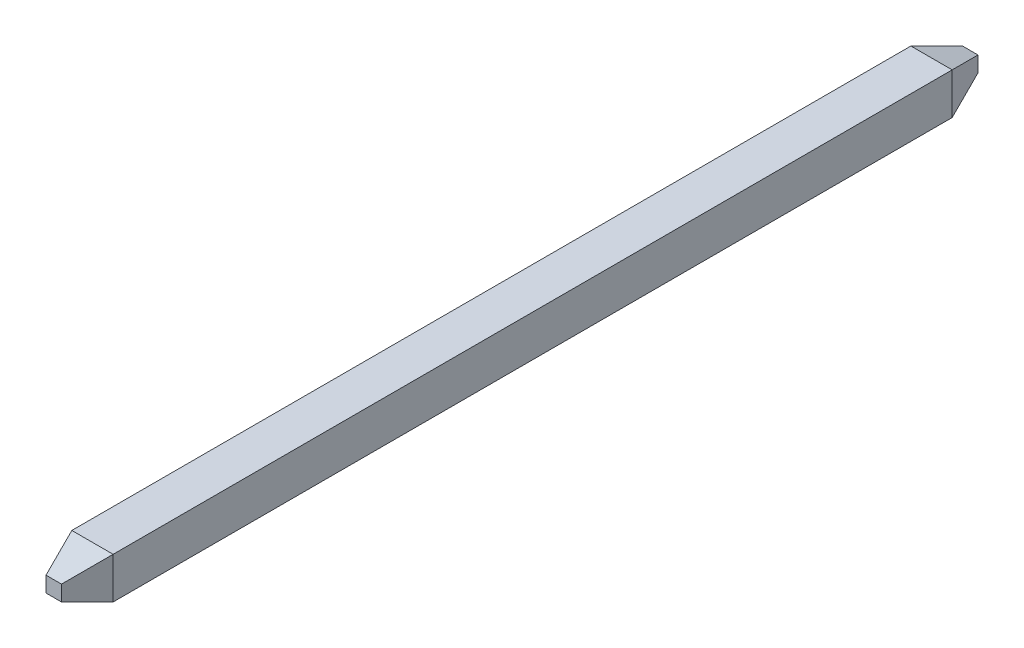
ISO-10303-21;
HEADER;
FILE_DESCRIPTION(('STEP AP214'),'2;1');
FILE_NAME('part.step','',(''),(''),'','','');
FILE_SCHEMA(('AUTOMOTIVE_DESIGN { 1 0 10303 214 1 1 1 1 }'));
ENDSEC;
DATA;
#1=APPLICATION_CONTEXT('core data for automotive mechanical design processes');
#2=APPLICATION_PROTOCOL_DEFINITION('international standard','automotive_design',2000,#1);
#3=PRODUCT_CONTEXT('',#1,'mechanical');
#4=PRODUCT('Part','Part','',(#3));
#5=PRODUCT_RELATED_PRODUCT_CATEGORY('part','',(#4));
#6=PRODUCT_DEFINITION_FORMATION('','',#4);
#7=PRODUCT_DEFINITION_CONTEXT('part definition',#1,'design');
#8=PRODUCT_DEFINITION('design','',#6,#7);
#9=PRODUCT_DEFINITION_SHAPE('','',#8);
#10=(LENGTH_UNIT() NAMED_UNIT(*) SI_UNIT(.MILLI.,.METRE.));
#11=(NAMED_UNIT(*) PLANE_ANGLE_UNIT() SI_UNIT($,.RADIAN.));
#12=(NAMED_UNIT(*) SI_UNIT($,.STERADIAN.) SOLID_ANGLE_UNIT());
#13=UNCERTAINTY_MEASURE_WITH_UNIT(LENGTH_MEASURE(1.E-05),#10,'distance_accuracy_value','');
#14=(GEOMETRIC_REPRESENTATION_CONTEXT(3) GLOBAL_UNCERTAINTY_ASSIGNED_CONTEXT((#13)) GLOBAL_UNIT_ASSIGNED_CONTEXT((#10,
#11,#12)) REPRESENTATION_CONTEXT('',''));
#15=CARTESIAN_POINT('',(0.,0.,0.));
#16=DIRECTION('',(0.,0.,1.));
#17=DIRECTION('',(1.,0.,0.));
#18=AXIS2_PLACEMENT_3D('',#15,#16,#17);
#19=CARTESIAN_POINT('',(0.32,0.,0.));
#20=DIRECTION('',(1.,0.,0.));
#21=DIRECTION('',(0.,1.,0.));
#22=AXIS2_PLACEMENT_3D('',#19,#20,#21);
#23=PLANE('',#22);
#24=DIRECTION('',(0.,0.,-1.));
#25=VECTOR('',#24,1.);
#26=CARTESIAN_POINT('',(0.32,-0.32,7.1));
#27=LINE('',#26,#25);
#28=CARTESIAN_POINT('',(0.32,-0.32,6.5));
#29=VERTEX_POINT('',#28);
#30=CARTESIAN_POINT('',(0.32,-0.32,-6.5));
#31=VERTEX_POINT('',#30);
#32=EDGE_CURVE('E115',#29,#31,#27,.T.);
#33=ORIENTED_EDGE('',*,*,#32,.T.);
#34=DIRECTION('',(0.,1.,0.));
#35=VECTOR('',#34,1.);
#36=CARTESIAN_POINT('',(0.32,0.32,-6.5));
#37=LINE('',#36,#35);
#38=CARTESIAN_POINT('',(0.32,0.32,-6.5));
#39=VERTEX_POINT('',#38);
#40=EDGE_CURVE('E85',#31,#39,#37,.T.);
#41=ORIENTED_EDGE('',*,*,#40,.T.);
#42=DIRECTION('',(0.,0.,1.));
#43=VECTOR('',#42,1.);
#44=CARTESIAN_POINT('',(0.32,0.32,-7.1));
#45=LINE('',#44,#43);
#46=CARTESIAN_POINT('',(0.32,0.32,6.5));
#47=VERTEX_POINT('',#46);
#48=EDGE_CURVE('E113',#39,#47,#45,.T.);
#49=ORIENTED_EDGE('',*,*,#48,.T.);
#50=DIRECTION('',(0.,-1.,0.));
#51=VECTOR('',#50,1.);
#52=CARTESIAN_POINT('',(0.32,-0.32,6.5));
#53=LINE('',#52,#51);
#54=EDGE_CURVE('E11',#47,#29,#53,.T.);
#55=ORIENTED_EDGE('',*,*,#54,.T.);
#56=EDGE_LOOP('',(#33,#41,#49,#55));
#57=FACE_BOUND('',#56,.T.);
#58=ADVANCED_FACE('F17',(#57),#23,.T.);
#59=CARTESIAN_POINT('',(-0.32,0.,0.));
#60=DIRECTION('',(1.,0.,0.));
#61=DIRECTION('',(0.,1.,0.));
#62=AXIS2_PLACEMENT_3D('',#59,#60,#61);
#63=PLANE('',#62);
#64=DIRECTION('',(0.,0.,1.));
#65=VECTOR('',#64,1.);
#66=CARTESIAN_POINT('',(-0.32,0.32,-7.1));
#67=LINE('',#66,#65);
#68=CARTESIAN_POINT('',(-0.32,0.32,-6.5));
#69=VERTEX_POINT('',#68);
#70=CARTESIAN_POINT('',(-0.32,0.32,6.5));
#71=VERTEX_POINT('',#70);
#72=EDGE_CURVE('E140',#69,#71,#67,.T.);
#73=ORIENTED_EDGE('',*,*,#72,.F.);
#74=DIRECTION('',(0.,-1.,0.));
#75=VECTOR('',#74,1.);
#76=CARTESIAN_POINT('',(-0.32,0.,-6.5));
#77=LINE('',#76,#75);
#78=CARTESIAN_POINT('',(-0.32,-0.32,-6.5));
#79=VERTEX_POINT('',#78);
#80=EDGE_CURVE('E97',#69,#79,#77,.T.);
#81=ORIENTED_EDGE('',*,*,#80,.T.);
#82=DIRECTION('',(0.,0.,-1.));
#83=VECTOR('',#82,1.);
#84=CARTESIAN_POINT('',(-0.32,-0.32,7.1));
#85=LINE('',#84,#83);
#86=CARTESIAN_POINT('',(-0.32,-0.32,6.5));
#87=VERTEX_POINT('',#86);
#88=EDGE_CURVE('E160',#87,#79,#85,.T.);
#89=ORIENTED_EDGE('',*,*,#88,.F.);
#90=DIRECTION('',(0.,1.,0.));
#91=VECTOR('',#90,1.);
#92=CARTESIAN_POINT('',(-0.32,0.,6.5));
#93=LINE('',#92,#91);
#94=EDGE_CURVE('E166',#87,#71,#93,.T.);
#95=ORIENTED_EDGE('',*,*,#94,.T.);
#96=EDGE_LOOP('',(#73,#81,#89,#95));
#97=FACE_BOUND('',#96,.T.);
#98=ADVANCED_FACE('F250',(#97),#63,.F.);
#99=CARTESIAN_POINT('',(0.32,-0.32,6.5));
#100=DIRECTION('',(0.,0.948683298050514,-0.316227766016838));
#101=DIRECTION('',(-1.,0.,0.));
#102=AXIS2_PLACEMENT_3D('',#99,#100,#101);
#103=PLANE('',#102);
#104=DIRECTION('',(0.301511344578037,0.301511344578037,0.904534033733109));
#105=VECTOR('',#104,1.);
#106=CARTESIAN_POINT('',(-0.08,-0.08,7.22));
#107=LINE('',#106,#105);
#108=CARTESIAN_POINT('',(-0.12,-0.12,7.1));
#109=VERTEX_POINT('',#108);
#110=EDGE_CURVE('E42',#87,#109,#107,.T.);
#111=ORIENTED_EDGE('',*,*,#110,.F.);
#112=DIRECTION('',(-1.,0.,0.));
#113=VECTOR('',#112,1.);
#114=CARTESIAN_POINT('',(0.32,-0.32,6.5));
#115=LINE('',#114,#113);
#116=EDGE_CURVE('E178',#29,#87,#115,.T.);
#117=ORIENTED_EDGE('',*,*,#116,.F.);
#118=DIRECTION('',(0.301511344578037,-0.301511344578037,-0.904534033733109));
#119=VECTOR('',#118,1.);
#120=CARTESIAN_POINT('',(0.32,-0.32,6.5));
#121=LINE('',#120,#119);
#122=CARTESIAN_POINT('',(0.12,-0.12,7.1));
#123=VERTEX_POINT('',#122);
#124=EDGE_CURVE('E28',#123,#29,#121,.T.);
#125=ORIENTED_EDGE('',*,*,#124,.F.);
#126=DIRECTION('',(1.,0.,0.));
#127=VECTOR('',#126,1.);
#128=CARTESIAN_POINT('',(0.32,-0.12,7.1));
#129=LINE('',#128,#127);
#130=EDGE_CURVE('E131',#109,#123,#129,.T.);
#131=ORIENTED_EDGE('',*,*,#130,.F.);
#132=EDGE_LOOP('',(#111,#117,#125,#131));
#133=FACE_BOUND('',#132,.T.);
#134=ADVANCED_FACE('F245',(#133),#103,.F.);
#135=CARTESIAN_POINT('',(0.32,0.,6.5));
#136=DIRECTION('',(0.948683298050514,0.,0.316227766016838));
#137=DIRECTION('',(0.,-1.,0.));
#138=AXIS2_PLACEMENT_3D('',#135,#136,#137);
#139=PLANE('',#138);
#140=ORIENTED_EDGE('',*,*,#124,.T.);
#141=ORIENTED_EDGE('',*,*,#54,.F.);
#142=DIRECTION('',(0.301511344578037,0.301511344578037,-0.904534033733109));
#143=VECTOR('',#142,1.);
#144=CARTESIAN_POINT('',(0.290909090909,0.290909090909,6.587272727273));
#145=LINE('',#144,#143);
#146=CARTESIAN_POINT('',(0.12,0.12,7.1));
#147=VERTEX_POINT('',#146);
#148=EDGE_CURVE('E118',#147,#47,#145,.T.);
#149=ORIENTED_EDGE('',*,*,#148,.F.);
#150=DIRECTION('',(0.,1.,0.));
#151=VECTOR('',#150,1.);
#152=CARTESIAN_POINT('',(0.12,0.32,7.1));
#153=LINE('',#152,#151);
#154=EDGE_CURVE('E173',#123,#147,#153,.T.);
#155=ORIENTED_EDGE('',*,*,#154,.F.);
#156=EDGE_LOOP('',(#140,#141,#149,#155));
#157=FACE_BOUND('',#156,.T.);
#158=ADVANCED_FACE('F19',(#157),#139,.T.);
#159=CARTESIAN_POINT('',(-0.12,0.32,7.1));
#160=DIRECTION('',(0.948683298050514,0.,-0.316227766016838));
#161=DIRECTION('',(0.,-1.,0.));
#162=AXIS2_PLACEMENT_3D('',#159,#160,#161);
#163=PLANE('',#162);
#164=ORIENTED_EDGE('',*,*,#110,.T.);
#165=DIRECTION('',(0.,-1.,0.));
#166=VECTOR('',#165,1.);
#167=CARTESIAN_POINT('',(-0.12,0.32,7.1));
#168=LINE('',#167,#166);
#169=CARTESIAN_POINT('',(-0.12,0.12,7.1));
#170=VERTEX_POINT('',#169);
#171=EDGE_CURVE('E341',#170,#109,#168,.T.);
#172=ORIENTED_EDGE('',*,*,#171,.F.);
#173=DIRECTION('',(-0.301511344578037,0.301511344578037,-0.904534033733109));
#174=VECTOR('',#173,1.);
#175=CARTESIAN_POINT('',(-0.138181818182,0.138181818182,7.045454545455));
#176=LINE('',#175,#174);
#177=EDGE_CURVE('E157',#170,#71,#176,.T.);
#178=ORIENTED_EDGE('',*,*,#177,.T.);
#179=ORIENTED_EDGE('',*,*,#94,.F.);
#180=EDGE_LOOP('',(#164,#172,#178,#179));
#181=FACE_BOUND('',#180,.T.);
#182=ADVANCED_FACE('F230',(#181),#163,.F.);
#183=CARTESIAN_POINT('',(0.32,0.12,7.1));
#184=DIRECTION('',(0.,-0.948683298050514,-0.316227766016838));
#185=DIRECTION('',(0.,0.316227766016838,-0.948683298050514));
#186=AXIS2_PLACEMENT_3D('',#183,#184,#185);
#187=PLANE('',#186);
#188=ORIENTED_EDGE('',*,*,#148,.T.);
#189=DIRECTION('',(1.,0.,0.));
#190=VECTOR('',#189,1.);
#191=CARTESIAN_POINT('',(0.32,0.32,6.5));
#192=LINE('',#191,#190);
#193=EDGE_CURVE('E145',#71,#47,#192,.T.);
#194=ORIENTED_EDGE('',*,*,#193,.F.);
#195=ORIENTED_EDGE('',*,*,#177,.F.);
#196=DIRECTION('',(-1.,0.,0.));
#197=VECTOR('',#196,1.);
#198=CARTESIAN_POINT('',(0.32,0.12,7.1));
#199=LINE('',#198,#197);
#200=EDGE_CURVE('E177',#147,#170,#199,.T.);
#201=ORIENTED_EDGE('',*,*,#200,.F.);
#202=EDGE_LOOP('',(#188,#194,#195,#201));
#203=FACE_BOUND('',#202,.T.);
#204=ADVANCED_FACE('F225',(#203),#187,.F.);
#205=CARTESIAN_POINT('',(0.32,-0.12,-7.1));
#206=DIRECTION('',(0.,0.948683298050514,0.316227766016838));
#207=DIRECTION('',(1.,0.,0.));
#208=AXIS2_PLACEMENT_3D('',#205,#206,#207);
#209=PLANE('',#208);
#210=DIRECTION('',(0.301511344578037,0.301511344578037,-0.904534033733109));
#211=VECTOR('',#210,1.);
#212=CARTESIAN_POINT('',(-0.08,-0.08,-7.22));
#213=LINE('',#212,#211);
#214=CARTESIAN_POINT('',(-0.12,-0.12,-7.1));
#215=VERTEX_POINT('',#214);
#216=EDGE_CURVE('E186',#79,#215,#213,.T.);
#217=ORIENTED_EDGE('',*,*,#216,.T.);
#218=DIRECTION('',(-1.,0.,0.));
#219=VECTOR('',#218,1.);
#220=CARTESIAN_POINT('',(0.32,-0.12,-7.1));
#221=LINE('',#220,#219);
#222=CARTESIAN_POINT('',(0.12,-0.12,-7.1));
#223=VERTEX_POINT('',#222);
#224=EDGE_CURVE('E147',#223,#215,#221,.T.);
#225=ORIENTED_EDGE('',*,*,#224,.F.);
#226=DIRECTION('',(0.301511344578037,-0.301511344578037,0.904534033733109));
#227=VECTOR('',#226,1.);
#228=CARTESIAN_POINT('',(0.290909090909,-0.290909090909,-6.587272727273));
#229=LINE('',#228,#227);
#230=EDGE_CURVE('E119',#223,#31,#229,.T.);
#231=ORIENTED_EDGE('',*,*,#230,.T.);
#232=DIRECTION('',(1.,0.,0.));
#233=VECTOR('',#232,1.);
#234=CARTESIAN_POINT('',(0.32,-0.32,-6.5));
#235=LINE('',#234,#233);
#236=EDGE_CURVE('E161',#79,#31,#235,.T.);
#237=ORIENTED_EDGE('',*,*,#236,.F.);
#238=EDGE_LOOP('',(#217,#225,#231,#237));
#239=FACE_BOUND('',#238,.T.);
#240=ADVANCED_FACE('F219',(#239),#209,.F.);
#241=CARTESIAN_POINT('',(0.32,0.,-6.5));
#242=DIRECTION('',(0.948683298050514,0.,-0.316227766016838));
#243=DIRECTION('',(0.,-1.,0.));
#244=AXIS2_PLACEMENT_3D('',#241,#242,#243);
#245=PLANE('',#244);
#246=ORIENTED_EDGE('',*,*,#230,.F.);
#247=DIRECTION('',(0.,-1.,0.));
#248=VECTOR('',#247,1.);
#249=CARTESIAN_POINT('',(0.12,-0.32,-7.1));
#250=LINE('',#249,#248);
#251=CARTESIAN_POINT('',(0.12,0.12,-7.1));
#252=VERTEX_POINT('',#251);
#253=EDGE_CURVE('E126',#252,#223,#250,.T.);
#254=ORIENTED_EDGE('',*,*,#253,.F.);
#255=DIRECTION('',(-0.301511344578037,-0.301511344578037,-0.904534033733109));
#256=VECTOR('',#255,1.);
#257=CARTESIAN_POINT('',(0.290909090909,0.290909090909,-6.587272727273));
#258=LINE('',#257,#256);
#259=EDGE_CURVE('E122',#39,#252,#258,.T.);
#260=ORIENTED_EDGE('',*,*,#259,.F.);
#261=ORIENTED_EDGE('',*,*,#40,.F.);
#262=EDGE_LOOP('',(#246,#254,#260,#261));
#263=FACE_BOUND('',#262,.T.);
#264=ADVANCED_FACE('F124',(#263),#245,.T.);
#265=CARTESIAN_POINT('',(-0.12,-0.32,-7.1));
#266=DIRECTION('',(0.948683298050514,0.,0.316227766016838));
#267=DIRECTION('',(0.,-1.,0.));
#268=AXIS2_PLACEMENT_3D('',#265,#266,#267);
#269=PLANE('',#268);
#270=ORIENTED_EDGE('',*,*,#216,.F.);
#271=ORIENTED_EDGE('',*,*,#80,.F.);
#272=DIRECTION('',(0.301511344578037,-0.301511344578037,-0.904534033733109));
#273=VECTOR('',#272,1.);
#274=CARTESIAN_POINT('',(-0.08,0.08,-7.22));
#275=LINE('',#274,#273);
#276=CARTESIAN_POINT('',(-0.12,0.12,-7.1));
#277=VERTEX_POINT('',#276);
#278=EDGE_CURVE('E21',#69,#277,#275,.T.);
#279=ORIENTED_EDGE('',*,*,#278,.T.);
#280=DIRECTION('',(0.,1.,0.));
#281=VECTOR('',#280,1.);
#282=CARTESIAN_POINT('',(-0.12,-0.32,-7.1));
#283=LINE('',#282,#281);
#284=EDGE_CURVE('E172',#215,#277,#283,.T.);
#285=ORIENTED_EDGE('',*,*,#284,.F.);
#286=EDGE_LOOP('',(#270,#271,#279,#285));
#287=FACE_BOUND('',#286,.T.);
#288=ADVANCED_FACE('F207',(#287),#269,.F.);
#289=CARTESIAN_POINT('',(0.32,0.32,-6.5));
#290=DIRECTION('',(0.,-0.948683298050514,0.316227766016838));
#291=DIRECTION('',(-1.,0.,0.));
#292=AXIS2_PLACEMENT_3D('',#289,#290,#291);
#293=PLANE('',#292);
#294=ORIENTED_EDGE('',*,*,#259,.T.);
#295=DIRECTION('',(1.,0.,0.));
#296=VECTOR('',#295,1.);
#297=CARTESIAN_POINT('',(0.32,0.12,-7.1));
#298=LINE('',#297,#296);
#299=EDGE_CURVE('E169',#277,#252,#298,.T.);
#300=ORIENTED_EDGE('',*,*,#299,.F.);
#301=ORIENTED_EDGE('',*,*,#278,.F.);
#302=DIRECTION('',(-1.,0.,0.));
#303=VECTOR('',#302,1.);
#304=CARTESIAN_POINT('',(0.32,0.32,-6.5));
#305=LINE('',#304,#303);
#306=EDGE_CURVE('E135',#39,#69,#305,.T.);
#307=ORIENTED_EDGE('',*,*,#306,.F.);
#308=EDGE_LOOP('',(#294,#300,#301,#307));
#309=FACE_BOUND('',#308,.T.);
#310=ADVANCED_FACE('F136',(#309),#293,.F.);
#311=CARTESIAN_POINT('',(0.32,0.32,7.1));
#312=DIRECTION('',(0.,0.,-1.));
#313=DIRECTION('',(0.,-1.,0.));
#314=AXIS2_PLACEMENT_3D('',#311,#312,#313);
#315=PLANE('',#314);
#316=ORIENTED_EDGE('',*,*,#154,.T.);
#317=ORIENTED_EDGE('',*,*,#200,.T.);
#318=ORIENTED_EDGE('',*,*,#171,.T.);
#319=ORIENTED_EDGE('',*,*,#130,.T.);
#320=EDGE_LOOP('',(#316,#317,#318,#319));
#321=FACE_BOUND('',#320,.T.);
#322=ADVANCED_FACE('F206',(#321),#315,.F.);
#323=CARTESIAN_POINT('',(0.32,-0.32,7.1));
#324=DIRECTION('',(0.,1.,0.));
#325=DIRECTION('',(1.,0.,0.));
#326=AXIS2_PLACEMENT_3D('',#323,#324,#325);
#327=PLANE('',#326);
#328=ORIENTED_EDGE('',*,*,#88,.T.);
#329=ORIENTED_EDGE('',*,*,#236,.T.);
#330=ORIENTED_EDGE('',*,*,#32,.F.);
#331=ORIENTED_EDGE('',*,*,#116,.T.);
#332=EDGE_LOOP('',(#328,#329,#330,#331));
#333=FACE_BOUND('',#332,.T.);
#334=ADVANCED_FACE('F302',(#333),#327,.F.);
#335=CARTESIAN_POINT('',(0.32,0.32,-7.1));
#336=DIRECTION('',(0.,-1.,0.));
#337=DIRECTION('',(0.,0.,-1.));
#338=AXIS2_PLACEMENT_3D('',#335,#336,#337);
#339=PLANE('',#338);
#340=ORIENTED_EDGE('',*,*,#48,.F.);
#341=ORIENTED_EDGE('',*,*,#306,.T.);
#342=ORIENTED_EDGE('',*,*,#72,.T.);
#343=ORIENTED_EDGE('',*,*,#193,.T.);
#344=EDGE_LOOP('',(#340,#341,#342,#343));
#345=FACE_BOUND('',#344,.T.);
#346=ADVANCED_FACE('F143',(#345),#339,.F.);
#347=CARTESIAN_POINT('',(0.32,-0.32,-7.1));
#348=DIRECTION('',(0.,0.,1.));
#349=DIRECTION('',(1.,0.,0.));
#350=AXIS2_PLACEMENT_3D('',#347,#348,#349);
#351=PLANE('',#350);
#352=ORIENTED_EDGE('',*,*,#284,.T.);
#353=ORIENTED_EDGE('',*,*,#299,.T.);
#354=ORIENTED_EDGE('',*,*,#253,.T.);
#355=ORIENTED_EDGE('',*,*,#224,.T.);
#356=EDGE_LOOP('',(#352,#353,#354,#355));
#357=FACE_BOUND('',#356,.T.);
#358=ADVANCED_FACE('F281',(#357),#351,.F.);
#359=CLOSED_SHELL('',(#58,#98,#134,#158,#182,#204,#240,#264,#288,#310,#322,#334,#346,#358));
#360=MANIFOLD_SOLID_BREP('B1',#359);
#361=ADVANCED_BREP_SHAPE_REPRESENTATION('',(#18,#360),#14);
#362=SHAPE_DEFINITION_REPRESENTATION(#9,#361);
ENDSEC;
END-ISO-10303-21;
